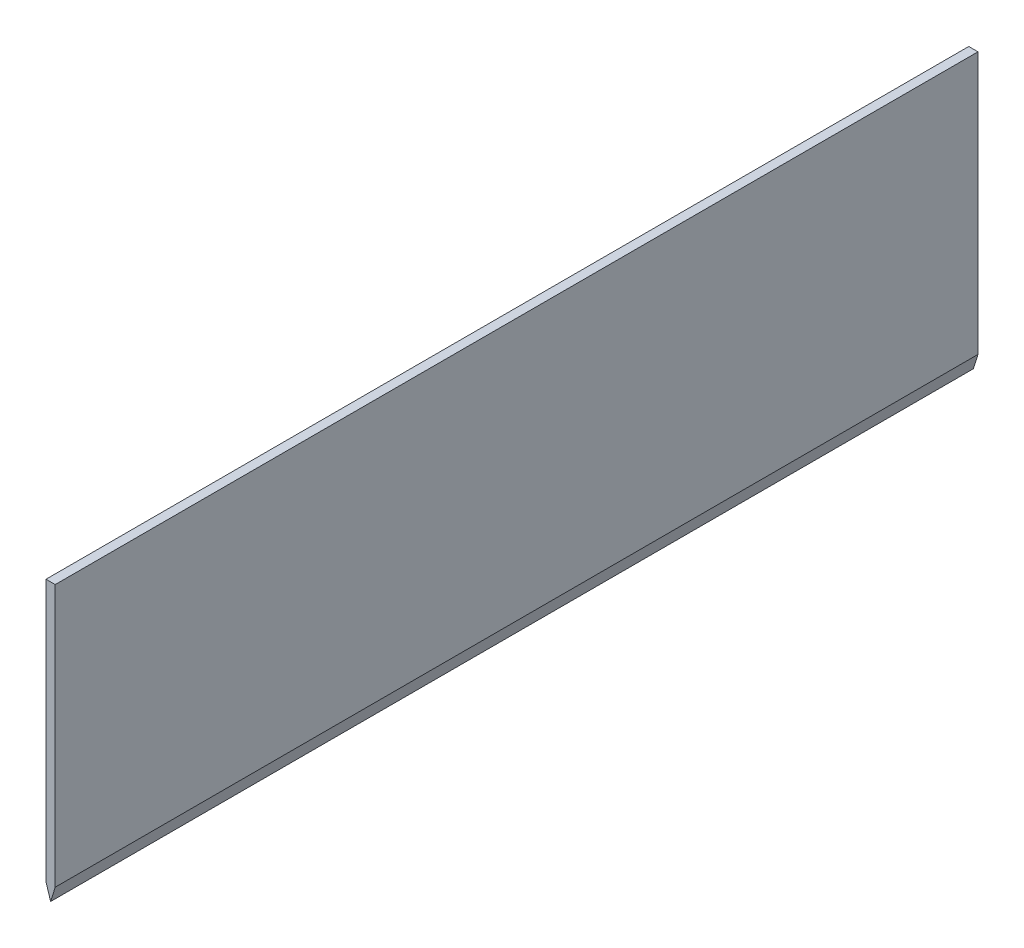
ISO-10303-21;
HEADER;
FILE_DESCRIPTION(('STEP AP214'),'2;1');
FILE_NAME('part.step','',(''),(''),'','','');
FILE_SCHEMA(('AUTOMOTIVE_DESIGN { 1 0 10303 214 1 1 1 1 }'));
ENDSEC;
DATA;
#1=APPLICATION_CONTEXT('core data for automotive mechanical design processes');
#2=APPLICATION_PROTOCOL_DEFINITION('international standard','automotive_design',2000,#1);
#3=PRODUCT_CONTEXT('',#1,'mechanical');
#4=PRODUCT('Part','Part','',(#3));
#5=PRODUCT_RELATED_PRODUCT_CATEGORY('part','',(#4));
#6=PRODUCT_DEFINITION_FORMATION('','',#4);
#7=PRODUCT_DEFINITION_CONTEXT('part definition',#1,'design');
#8=PRODUCT_DEFINITION('design','',#6,#7);
#9=PRODUCT_DEFINITION_SHAPE('','',#8);
#10=(LENGTH_UNIT() NAMED_UNIT(*) SI_UNIT(.MILLI.,.METRE.));
#11=(NAMED_UNIT(*) PLANE_ANGLE_UNIT() SI_UNIT($,.RADIAN.));
#12=(NAMED_UNIT(*) SI_UNIT($,.STERADIAN.) SOLID_ANGLE_UNIT());
#13=UNCERTAINTY_MEASURE_WITH_UNIT(LENGTH_MEASURE(1.E-05),#10,'distance_accuracy_value','');
#14=(GEOMETRIC_REPRESENTATION_CONTEXT(3) GLOBAL_UNCERTAINTY_ASSIGNED_CONTEXT((#13)) GLOBAL_UNIT_ASSIGNED_CONTEXT((#10,
#11,#12)) REPRESENTATION_CONTEXT('',''));
#15=CARTESIAN_POINT('',(0.,0.,0.));
#16=DIRECTION('',(0.,0.,1.));
#17=DIRECTION('',(1.,0.,0.));
#18=AXIS2_PLACEMENT_3D('',#15,#16,#17);
#19=CARTESIAN_POINT('',(-0.5,0.,50.));
#20=DIRECTION('',(1.,0.,0.));
#21=DIRECTION('',(0.,1.,0.));
#22=AXIS2_PLACEMENT_3D('',#19,#20,#21);
#23=PLANE('',#22);
#24=DIRECTION('',(0.,-1.,0.));
#25=VECTOR('',#24,1.);
#26=CARTESIAN_POINT('',(-0.5,0.,-50.));
#27=LINE('',#26,#25);
#28=CARTESIAN_POINT('',(-0.500000000000002,15.,-50.));
#29=VERTEX_POINT('',#28);
#30=CARTESIAN_POINT('',(-0.499999999999999,-13.4023662531677,-50.));
#31=VERTEX_POINT('',#30);
#32=EDGE_CURVE('E108',#29,#31,#27,.T.);
#33=ORIENTED_EDGE('',*,*,#32,.T.);
#34=DIRECTION('',(0.,0.,-1.));
#35=VECTOR('',#34,1.);
#36=CARTESIAN_POINT('',(-0.499999999999999,-13.4023662531677,50.));
#37=LINE('',#36,#35);
#38=CARTESIAN_POINT('',(-0.499999999999999,-13.4023662531677,50.));
#39=VERTEX_POINT('',#38);
#40=EDGE_CURVE('E11',#39,#31,#37,.T.);
#41=ORIENTED_EDGE('',*,*,#40,.F.);
#42=DIRECTION('',(0.,-1.,0.));
#43=VECTOR('',#42,1.);
#44=CARTESIAN_POINT('',(-0.5,0.,50.));
#45=LINE('',#44,#43);
#46=CARTESIAN_POINT('',(-0.500000000000002,15.,50.));
#47=VERTEX_POINT('',#46);
#48=EDGE_CURVE('E118',#47,#39,#45,.T.);
#49=ORIENTED_EDGE('',*,*,#48,.F.);
#50=DIRECTION('',(0.,0.,-1.));
#51=VECTOR('',#50,1.);
#52=CARTESIAN_POINT('',(-0.500000000000002,15.,50.));
#53=LINE('',#52,#51);
#54=EDGE_CURVE('E49',#47,#29,#53,.T.);
#55=ORIENTED_EDGE('',*,*,#54,.T.);
#56=EDGE_LOOP('',(#33,#41,#49,#55));
#57=FACE_BOUND('',#56,.T.);
#58=ADVANCED_FACE('F33',(#57),#23,.F.);
#59=CARTESIAN_POINT('',(-4.27565996503906,-1.33812269974789,50.));
#60=DIRECTION('',(0.95435413763278,0.298677384452176,0.));
#61=DIRECTION('',(-0.298677384452176,0.95435413763278,0.));
#62=AXIS2_PLACEMENT_3D('',#59,#60,#61);
#63=PLANE('',#62);
#64=DIRECTION('',(0.298677384452176,-0.95435413763278,0.));
#65=VECTOR('',#64,1.);
#66=CARTESIAN_POINT('',(-4.27565996503906,-1.33812269974789,-50.));
#67=LINE('',#66,#65);
#68=CARTESIAN_POINT('',(0.,-15.,-50.));
#69=VERTEX_POINT('',#68);
#70=EDGE_CURVE('E110',#31,#69,#67,.T.);
#71=ORIENTED_EDGE('',*,*,#70,.T.);
#72=DIRECTION('',(0.,0.,-1.));
#73=VECTOR('',#72,1.);
#74=CARTESIAN_POINT('',(0.,-15.,50.));
#75=LINE('',#74,#73);
#76=CARTESIAN_POINT('',(0.,-15.,50.));
#77=VERTEX_POINT('',#76);
#78=EDGE_CURVE('E41',#77,#69,#75,.T.);
#79=ORIENTED_EDGE('',*,*,#78,.F.);
#80=DIRECTION('',(0.298677384452176,-0.95435413763278,0.));
#81=VECTOR('',#80,1.);
#82=CARTESIAN_POINT('',(-4.27565996503906,-1.33812269974789,50.));
#83=LINE('',#82,#81);
#84=EDGE_CURVE('E78',#39,#77,#83,.T.);
#85=ORIENTED_EDGE('',*,*,#84,.F.);
#86=ORIENTED_EDGE('',*,*,#40,.T.);
#87=EDGE_LOOP('',(#71,#79,#85,#86));
#88=FACE_BOUND('',#87,.T.);
#89=ADVANCED_FACE('F133',(#88),#63,.F.);
#90=CARTESIAN_POINT('',(4.27565996503906,-1.33812269974789,50.));
#91=DIRECTION('',(-0.95435413763278,0.298677384452176,0.));
#92=DIRECTION('',(-0.298677384452176,-0.95435413763278,0.));
#93=AXIS2_PLACEMENT_3D('',#90,#91,#92);
#94=PLANE('',#93);
#95=DIRECTION('',(0.298677384452176,0.95435413763278,0.));
#96=VECTOR('',#95,1.);
#97=CARTESIAN_POINT('',(4.27565996503906,-1.33812269974789,-50.));
#98=LINE('',#97,#96);
#99=CARTESIAN_POINT('',(0.500000000000002,-13.4023662531677,-50.));
#100=VERTEX_POINT('',#99);
#101=EDGE_CURVE('E98',#69,#100,#98,.T.);
#102=ORIENTED_EDGE('',*,*,#101,.T.);
#103=DIRECTION('',(0.,0.,-1.));
#104=VECTOR('',#103,1.);
#105=CARTESIAN_POINT('',(0.500000000000002,-13.4023662531677,50.));
#106=LINE('',#105,#104);
#107=CARTESIAN_POINT('',(0.500000000000002,-13.4023662531677,50.));
#108=VERTEX_POINT('',#107);
#109=EDGE_CURVE('E95',#108,#100,#106,.T.);
#110=ORIENTED_EDGE('',*,*,#109,.F.);
#111=DIRECTION('',(0.298677384452176,0.95435413763278,0.));
#112=VECTOR('',#111,1.);
#113=CARTESIAN_POINT('',(4.27565996503906,-1.33812269974789,50.));
#114=LINE('',#113,#112);
#115=EDGE_CURVE('E85',#77,#108,#114,.T.);
#116=ORIENTED_EDGE('',*,*,#115,.F.);
#117=ORIENTED_EDGE('',*,*,#78,.T.);
#118=EDGE_LOOP('',(#102,#110,#116,#117));
#119=FACE_BOUND('',#118,.T.);
#120=ADVANCED_FACE('F96',(#119),#94,.F.);
#121=CARTESIAN_POINT('',(0.5,0.,50.));
#122=DIRECTION('',(1.,0.,0.));
#123=DIRECTION('',(0.,1.,0.));
#124=AXIS2_PLACEMENT_3D('',#121,#122,#123);
#125=PLANE('',#124);
#126=DIRECTION('',(0.,-1.,0.));
#127=VECTOR('',#126,1.);
#128=CARTESIAN_POINT('',(0.5,0.,-50.));
#129=LINE('',#128,#127);
#130=CARTESIAN_POINT('',(0.499999999999998,15.,-50.));
#131=VERTEX_POINT('',#130);
#132=EDGE_CURVE('E113',#131,#100,#129,.T.);
#133=ORIENTED_EDGE('',*,*,#132,.F.);
#134=DIRECTION('',(0.,0.,-1.));
#135=VECTOR('',#134,1.);
#136=CARTESIAN_POINT('',(0.499999999999998,15.,50.));
#137=LINE('',#136,#135);
#138=CARTESIAN_POINT('',(0.499999999999998,15.,50.));
#139=VERTEX_POINT('',#138);
#140=EDGE_CURVE('E66',#139,#131,#137,.T.);
#141=ORIENTED_EDGE('',*,*,#140,.F.);
#142=DIRECTION('',(0.,-1.,0.));
#143=VECTOR('',#142,1.);
#144=CARTESIAN_POINT('',(0.5,0.,50.));
#145=LINE('',#144,#143);
#146=EDGE_CURVE('E90',#139,#108,#145,.T.);
#147=ORIENTED_EDGE('',*,*,#146,.T.);
#148=ORIENTED_EDGE('',*,*,#109,.T.);
#149=EDGE_LOOP('',(#133,#141,#147,#148));
#150=FACE_BOUND('',#149,.T.);
#151=ADVANCED_FACE('F102',(#150),#125,.T.);
#152=CARTESIAN_POINT('',(0.,15.,50.));
#153=DIRECTION('',(0.,1.,0.));
#154=DIRECTION('',(0.,0.,1.));
#155=AXIS2_PLACEMENT_3D('',#152,#153,#154);
#156=PLANE('',#155);
#157=DIRECTION('',(1.,0.,0.));
#158=VECTOR('',#157,1.);
#159=CARTESIAN_POINT('',(0.,15.,-50.));
#160=LINE('',#159,#158);
#161=EDGE_CURVE('E115',#29,#131,#160,.T.);
#162=ORIENTED_EDGE('',*,*,#161,.F.);
#163=ORIENTED_EDGE('',*,*,#54,.F.);
#164=DIRECTION('',(1.,0.,0.));
#165=VECTOR('',#164,1.);
#166=CARTESIAN_POINT('',(0.,15.,50.));
#167=LINE('',#166,#165);
#168=EDGE_CURVE('E103',#47,#139,#167,.T.);
#169=ORIENTED_EDGE('',*,*,#168,.T.);
#170=ORIENTED_EDGE('',*,*,#140,.T.);
#171=EDGE_LOOP('',(#162,#163,#169,#170));
#172=FACE_BOUND('',#171,.T.);
#173=ADVANCED_FACE('F122',(#172),#156,.T.);
#174=CARTESIAN_POINT('',(0.,0.,50.));
#175=DIRECTION('',(0.,0.,1.));
#176=DIRECTION('',(1.,0.,0.));
#177=AXIS2_PLACEMENT_3D('',#174,#175,#176);
#178=PLANE('',#177);
#179=ORIENTED_EDGE('',*,*,#48,.T.);
#180=ORIENTED_EDGE('',*,*,#84,.T.);
#181=ORIENTED_EDGE('',*,*,#115,.T.);
#182=ORIENTED_EDGE('',*,*,#146,.F.);
#183=ORIENTED_EDGE('',*,*,#168,.F.);
#184=EDGE_LOOP('',(#179,#180,#181,#182,#183));
#185=FACE_BOUND('',#184,.T.);
#186=ADVANCED_FACE('F87',(#185),#178,.T.);
#187=CARTESIAN_POINT('',(0.,0.,-50.));
#188=DIRECTION('',(0.,0.,1.));
#189=DIRECTION('',(1.,0.,0.));
#190=AXIS2_PLACEMENT_3D('',#187,#188,#189);
#191=PLANE('',#190);
#192=ORIENTED_EDGE('',*,*,#32,.F.);
#193=ORIENTED_EDGE('',*,*,#161,.T.);
#194=ORIENTED_EDGE('',*,*,#132,.T.);
#195=ORIENTED_EDGE('',*,*,#101,.F.);
#196=ORIENTED_EDGE('',*,*,#70,.F.);
#197=EDGE_LOOP('',(#192,#193,#194,#195,#196));
#198=FACE_BOUND('',#197,.T.);
#199=ADVANCED_FACE('F121',(#198),#191,.F.);
#200=CLOSED_SHELL('',(#58,#89,#120,#151,#173,#186,#199));
#201=MANIFOLD_SOLID_BREP('B2',#200);
#202=ADVANCED_BREP_SHAPE_REPRESENTATION('',(#18,#201),#14);
#203=SHAPE_DEFINITION_REPRESENTATION(#9,#202);
ENDSEC;
END-ISO-10303-21;
